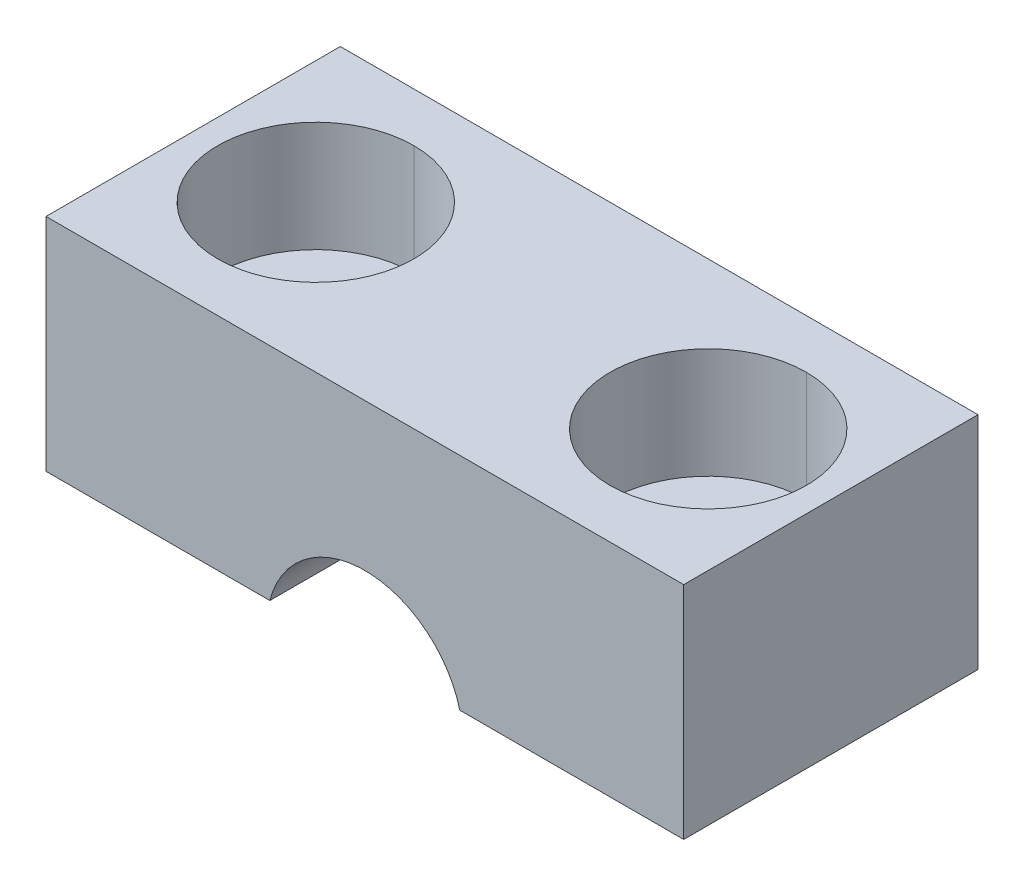
ISO-10303-21;
HEADER;
FILE_DESCRIPTION(('STEP AP214'),'2;1');
FILE_NAME('part.step','',(''),(''),'','','');
FILE_SCHEMA(('AUTOMOTIVE_DESIGN { 1 0 10303 214 1 1 1 1 }'));
ENDSEC;
DATA;
#1=APPLICATION_CONTEXT('core data for automotive mechanical design processes');
#2=APPLICATION_PROTOCOL_DEFINITION('international standard','automotive_design',2000,#1);
#3=PRODUCT_CONTEXT('',#1,'mechanical');
#4=PRODUCT('Part','Part','',(#3));
#5=PRODUCT_RELATED_PRODUCT_CATEGORY('part','',(#4));
#6=PRODUCT_DEFINITION_FORMATION('','',#4);
#7=PRODUCT_DEFINITION_CONTEXT('part definition',#1,'design');
#8=PRODUCT_DEFINITION('design','',#6,#7);
#9=PRODUCT_DEFINITION_SHAPE('','',#8);
#10=(LENGTH_UNIT() NAMED_UNIT(*) SI_UNIT(.MILLI.,.METRE.));
#11=(NAMED_UNIT(*) PLANE_ANGLE_UNIT() SI_UNIT($,.RADIAN.));
#12=(NAMED_UNIT(*) SI_UNIT($,.STERADIAN.) SOLID_ANGLE_UNIT());
#13=UNCERTAINTY_MEASURE_WITH_UNIT(LENGTH_MEASURE(1.E-05),#10,'distance_accuracy_value','');
#14=(GEOMETRIC_REPRESENTATION_CONTEXT(3) GLOBAL_UNCERTAINTY_ASSIGNED_CONTEXT((#13)) GLOBAL_UNIT_ASSIGNED_CONTEXT((#10,
#11,#12)) REPRESENTATION_CONTEXT('',''));
#15=CARTESIAN_POINT('',(0.,0.,0.));
#16=DIRECTION('',(0.,0.,1.));
#17=DIRECTION('',(1.,0.,0.));
#18=AXIS2_PLACEMENT_3D('',#15,#16,#17);
#19=CARTESIAN_POINT('',(13.,35.,6.));
#20=DIRECTION('',(0.,-1.,0.));
#21=DIRECTION('',(0.,0.,-1.));
#22=AXIS2_PLACEMENT_3D('',#19,#20,#21);
#23=PLANE('',#22);
#24=CARTESIAN_POINT('',(-8.,35.,0.));
#25=DIRECTION('',(0.,1.,0.));
#26=DIRECTION('',(0.,0.,1.));
#27=AXIS2_PLACEMENT_3D('',#24,#25,#26);
#28=CIRCLE('',#27,4.);
#29=CARTESIAN_POINT('',(-8.,35.,-4.));
#30=VERTEX_POINT('',#29);
#31=CARTESIAN_POINT('',(-8.,35.,4.));
#32=VERTEX_POINT('',#31);
#33=EDGE_CURVE('E11',#30,#32,#28,.T.);
#34=ORIENTED_EDGE('',*,*,#33,.F.);
#35=CARTESIAN_POINT('',(-8.,35.,0.));
#36=DIRECTION('',(0.,1.,0.));
#37=DIRECTION('',(0.,0.,1.));
#38=AXIS2_PLACEMENT_3D('',#35,#36,#37);
#39=CIRCLE('',#38,4.);
#40=EDGE_CURVE('E25',#32,#30,#39,.T.);
#41=ORIENTED_EDGE('',*,*,#40,.F.);
#42=EDGE_LOOP('',(#34,#41));
#43=FACE_BOUND('',#42,.T.);
#44=CARTESIAN_POINT('',(8.,35.,0.));
#45=DIRECTION('',(0.,1.,0.));
#46=DIRECTION('',(0.,0.,1.));
#47=AXIS2_PLACEMENT_3D('',#44,#45,#46);
#48=CIRCLE('',#47,4.);
#49=CARTESIAN_POINT('',(8.,35.,-4.));
#50=VERTEX_POINT('',#49);
#51=CARTESIAN_POINT('',(8.,35.,4.));
#52=VERTEX_POINT('',#51);
#53=EDGE_CURVE('E137',#50,#52,#48,.T.);
#54=ORIENTED_EDGE('',*,*,#53,.F.);
#55=CARTESIAN_POINT('',(8.,35.,0.));
#56=DIRECTION('',(0.,1.,0.));
#57=DIRECTION('',(0.,0.,1.));
#58=AXIS2_PLACEMENT_3D('',#55,#56,#57);
#59=CIRCLE('',#58,4.);
#60=EDGE_CURVE('E308',#52,#50,#59,.T.);
#61=ORIENTED_EDGE('',*,*,#60,.F.);
#62=EDGE_LOOP('',(#54,#61));
#63=FACE_BOUND('',#62,.T.);
#64=DIRECTION('',(-1.,0.,0.));
#65=VECTOR('',#64,1.);
#66=CARTESIAN_POINT('',(13.,35.,-6.));
#67=LINE('',#66,#65);
#68=CARTESIAN_POINT('',(13.,35.,-6.));
#69=VERTEX_POINT('',#68);
#70=CARTESIAN_POINT('',(-13.,35.,-6.));
#71=VERTEX_POINT('',#70);
#72=EDGE_CURVE('E304',#69,#71,#67,.T.);
#73=ORIENTED_EDGE('',*,*,#72,.T.);
#74=DIRECTION('',(0.,0.,-1.));
#75=VECTOR('',#74,1.);
#76=CARTESIAN_POINT('',(-13.,35.,6.));
#77=LINE('',#76,#75);
#78=CARTESIAN_POINT('',(-13.,35.,6.));
#79=VERTEX_POINT('',#78);
#80=EDGE_CURVE('E299',#79,#71,#77,.T.);
#81=ORIENTED_EDGE('',*,*,#80,.F.);
#82=DIRECTION('',(-1.,0.,0.));
#83=VECTOR('',#82,1.);
#84=CARTESIAN_POINT('',(13.,35.,6.));
#85=LINE('',#84,#83);
#86=CARTESIAN_POINT('',(13.,35.,6.));
#87=VERTEX_POINT('',#86);
#88=EDGE_CURVE('E294',#87,#79,#85,.T.);
#89=ORIENTED_EDGE('',*,*,#88,.F.);
#90=DIRECTION('',(0.,0.,-1.));
#91=VECTOR('',#90,1.);
#92=CARTESIAN_POINT('',(13.,35.,6.));
#93=LINE('',#92,#91);
#94=EDGE_CURVE('E290',#87,#69,#93,.T.);
#95=ORIENTED_EDGE('',*,*,#94,.T.);
#96=EDGE_LOOP('',(#73,#81,#89,#95));
#97=FACE_BOUND('',#96,.T.);
#98=ADVANCED_FACE('F17',(#43,#63,#97),#23,.F.);
#99=CARTESIAN_POINT('',(13.,26.,6.));
#100=DIRECTION('',(-1.,0.,0.));
#101=DIRECTION('',(0.,0.,1.));
#102=AXIS2_PLACEMENT_3D('',#99,#100,#101);
#103=PLANE('',#102);
#104=DIRECTION('',(0.,1.,0.));
#105=VECTOR('',#104,1.);
#106=CARTESIAN_POINT('',(13.,26.,-6.));
#107=LINE('',#106,#105);
#108=CARTESIAN_POINT('',(13.,26.,-6.));
#109=VERTEX_POINT('',#108);
#110=EDGE_CURVE('E285',#109,#69,#107,.T.);
#111=ORIENTED_EDGE('',*,*,#110,.T.);
#112=ORIENTED_EDGE('',*,*,#94,.F.);
#113=DIRECTION('',(0.,1.,0.));
#114=VECTOR('',#113,1.);
#115=CARTESIAN_POINT('',(13.,26.,6.));
#116=LINE('',#115,#114);
#117=CARTESIAN_POINT('',(13.,26.,6.));
#118=VERTEX_POINT('',#117);
#119=EDGE_CURVE('E280',#118,#87,#116,.T.);
#120=ORIENTED_EDGE('',*,*,#119,.F.);
#121=DIRECTION('',(0.,0.,-1.));
#122=VECTOR('',#121,1.);
#123=CARTESIAN_POINT('',(13.,26.,6.));
#124=LINE('',#123,#122);
#125=EDGE_CURVE('E276',#118,#109,#124,.T.);
#126=ORIENTED_EDGE('',*,*,#125,.T.);
#127=EDGE_LOOP('',(#111,#112,#120,#126));
#128=FACE_BOUND('',#127,.T.);
#129=ADVANCED_FACE('F369',(#128),#103,.F.);
#130=CARTESIAN_POINT('',(3.8729833462074,26.,6.));
#131=DIRECTION('',(0.,1.,0.));
#132=DIRECTION('',(0.,0.,1.));
#133=AXIS2_PLACEMENT_3D('',#130,#131,#132);
#134=PLANE('',#133);
#135=CARTESIAN_POINT('',(8.,26.,0.));
#136=DIRECTION('',(0.,1.,0.));
#137=DIRECTION('',(0.,0.,1.));
#138=AXIS2_PLACEMENT_3D('',#135,#136,#137);
#139=CIRCLE('',#138,2.25);
#140=CARTESIAN_POINT('',(8.,26.,2.25));
#141=VERTEX_POINT('',#140);
#142=CARTESIAN_POINT('',(8.,26.,-2.25));
#143=VERTEX_POINT('',#142);
#144=EDGE_CURVE('E272',#141,#143,#139,.T.);
#145=ORIENTED_EDGE('',*,*,#144,.T.);
#146=CARTESIAN_POINT('',(8.,26.,0.));
#147=DIRECTION('',(0.,1.,0.));
#148=DIRECTION('',(0.,0.,1.));
#149=AXIS2_PLACEMENT_3D('',#146,#147,#148);
#150=CIRCLE('',#149,2.25);
#151=EDGE_CURVE('E267',#143,#141,#150,.T.);
#152=ORIENTED_EDGE('',*,*,#151,.T.);
#153=EDGE_LOOP('',(#145,#152));
#154=FACE_BOUND('',#153,.T.);
#155=DIRECTION('',(1.,0.,0.));
#156=VECTOR('',#155,1.);
#157=CARTESIAN_POINT('',(3.8729833462074,26.,-6.));
#158=LINE('',#157,#156);
#159=CARTESIAN_POINT('',(3.8729833462074,26.,-6.));
#160=VERTEX_POINT('',#159);
#161=EDGE_CURVE('E261',#160,#109,#158,.T.);
#162=ORIENTED_EDGE('',*,*,#161,.T.);
#163=ORIENTED_EDGE('',*,*,#125,.F.);
#164=DIRECTION('',(1.,0.,0.));
#165=VECTOR('',#164,1.);
#166=CARTESIAN_POINT('',(3.8729833462074,26.,6.));
#167=LINE('',#166,#165);
#168=CARTESIAN_POINT('',(3.8729833462074,26.,6.));
#169=VERTEX_POINT('',#168);
#170=EDGE_CURVE('E255',#169,#118,#167,.T.);
#171=ORIENTED_EDGE('',*,*,#170,.F.);
#172=DIRECTION('',(0.,0.,-1.));
#173=VECTOR('',#172,1.);
#174=CARTESIAN_POINT('',(3.8729833462074,26.,6.));
#175=LINE('',#174,#173);
#176=EDGE_CURVE('E250',#169,#160,#175,.T.);
#177=ORIENTED_EDGE('',*,*,#176,.T.);
#178=EDGE_LOOP('',(#162,#163,#171,#177));
#179=FACE_BOUND('',#178,.T.);
#180=ADVANCED_FACE('F372',(#154,#179),#134,.F.);
#181=CARTESIAN_POINT('',(0.,25.,6.));
#182=DIRECTION('',(0.,0.,-1.));
#183=DIRECTION('',(0.,-1.,0.));
#184=AXIS2_PLACEMENT_3D('',#181,#182,#183);
#185=CYLINDRICAL_SURFACE('',#184,4.);
#186=CARTESIAN_POINT('',(0.,25.,-6.));
#187=DIRECTION('',(0.,0.,1.));
#188=DIRECTION('',(1.,0.,0.));
#189=AXIS2_PLACEMENT_3D('',#186,#187,#188);
#190=CIRCLE('',#189,4.);
#191=CARTESIAN_POINT('',(-3.8729833462074,26.,-6.));
#192=VERTEX_POINT('',#191);
#193=EDGE_CURVE('E244',#160,#192,#190,.T.);
#194=ORIENTED_EDGE('',*,*,#193,.F.);
#195=ORIENTED_EDGE('',*,*,#176,.F.);
#196=CARTESIAN_POINT('',(0.,25.,6.));
#197=DIRECTION('',(0.,0.,1.));
#198=DIRECTION('',(1.,0.,0.));
#199=AXIS2_PLACEMENT_3D('',#196,#197,#198);
#200=CIRCLE('',#199,4.);
#201=CARTESIAN_POINT('',(-3.8729833462074,26.,6.));
#202=VERTEX_POINT('',#201);
#203=EDGE_CURVE('E239',#169,#202,#200,.T.);
#204=ORIENTED_EDGE('',*,*,#203,.T.);
#205=DIRECTION('',(0.,0.,-1.));
#206=VECTOR('',#205,1.);
#207=CARTESIAN_POINT('',(-3.8729833462074,26.,6.));
#208=LINE('',#207,#206);
#209=EDGE_CURVE('E234',#202,#192,#208,.T.);
#210=ORIENTED_EDGE('',*,*,#209,.T.);
#211=EDGE_LOOP('',(#194,#195,#204,#210));
#212=FACE_BOUND('',#211,.T.);
#213=ADVANCED_FACE('F347',(#212),#185,.F.);
#214=CARTESIAN_POINT('',(-13.,26.,6.));
#215=DIRECTION('',(0.,1.,0.));
#216=DIRECTION('',(0.,0.,1.));
#217=AXIS2_PLACEMENT_3D('',#214,#215,#216);
#218=PLANE('',#217);
#219=CARTESIAN_POINT('',(-8.,26.,0.));
#220=DIRECTION('',(0.,1.,0.));
#221=DIRECTION('',(0.,0.,1.));
#222=AXIS2_PLACEMENT_3D('',#219,#220,#221);
#223=CIRCLE('',#222,2.25);
#224=CARTESIAN_POINT('',(-8.,26.,2.25));
#225=VERTEX_POINT('',#224);
#226=CARTESIAN_POINT('',(-8.,26.,-2.25));
#227=VERTEX_POINT('',#226);
#228=EDGE_CURVE('E229',#225,#227,#223,.T.);
#229=ORIENTED_EDGE('',*,*,#228,.T.);
#230=CARTESIAN_POINT('',(-8.,26.,0.));
#231=DIRECTION('',(0.,1.,0.));
#232=DIRECTION('',(0.,0.,1.));
#233=AXIS2_PLACEMENT_3D('',#230,#231,#232);
#234=CIRCLE('',#233,2.25);
#235=EDGE_CURVE('E225',#227,#225,#234,.T.);
#236=ORIENTED_EDGE('',*,*,#235,.T.);
#237=EDGE_LOOP('',(#229,#236));
#238=FACE_BOUND('',#237,.T.);
#239=DIRECTION('',(1.,0.,0.));
#240=VECTOR('',#239,1.);
#241=CARTESIAN_POINT('',(-13.,26.,-6.));
#242=LINE('',#241,#240);
#243=CARTESIAN_POINT('',(-13.,26.,-6.));
#244=VERTEX_POINT('',#243);
#245=EDGE_CURVE('E219',#244,#192,#242,.T.);
#246=ORIENTED_EDGE('',*,*,#245,.T.);
#247=ORIENTED_EDGE('',*,*,#209,.F.);
#248=DIRECTION('',(1.,0.,0.));
#249=VECTOR('',#248,1.);
#250=CARTESIAN_POINT('',(-13.,26.,6.));
#251=LINE('',#250,#249);
#252=CARTESIAN_POINT('',(-13.,26.,6.));
#253=VERTEX_POINT('',#252);
#254=EDGE_CURVE('E213',#253,#202,#251,.T.);
#255=ORIENTED_EDGE('',*,*,#254,.F.);
#256=DIRECTION('',(0.,0.,-1.));
#257=VECTOR('',#256,1.);
#258=CARTESIAN_POINT('',(-13.,26.,6.));
#259=LINE('',#258,#257);
#260=EDGE_CURVE('E209',#253,#244,#259,.T.);
#261=ORIENTED_EDGE('',*,*,#260,.T.);
#262=EDGE_LOOP('',(#246,#247,#255,#261));
#263=FACE_BOUND('',#262,.T.);
#264=ADVANCED_FACE('F343',(#238,#263),#218,.F.);
#265=CARTESIAN_POINT('',(-13.,35.,6.));
#266=DIRECTION('',(1.,0.,0.));
#267=DIRECTION('',(0.,0.,-1.));
#268=AXIS2_PLACEMENT_3D('',#265,#266,#267);
#269=PLANE('',#268);
#270=DIRECTION('',(0.,-1.,0.));
#271=VECTOR('',#270,1.);
#272=CARTESIAN_POINT('',(-13.,35.,-6.));
#273=LINE('',#272,#271);
#274=EDGE_CURVE('E204',#71,#244,#273,.T.);
#275=ORIENTED_EDGE('',*,*,#274,.T.);
#276=ORIENTED_EDGE('',*,*,#260,.F.);
#277=DIRECTION('',(0.,-1.,0.));
#278=VECTOR('',#277,1.);
#279=CARTESIAN_POINT('',(-13.,35.,6.));
#280=LINE('',#279,#278);
#281=EDGE_CURVE('E199',#79,#253,#280,.T.);
#282=ORIENTED_EDGE('',*,*,#281,.F.);
#283=ORIENTED_EDGE('',*,*,#80,.T.);
#284=EDGE_LOOP('',(#275,#276,#282,#283));
#285=FACE_BOUND('',#284,.T.);
#286=ADVANCED_FACE('F346',(#285),#269,.F.);
#287=CARTESIAN_POINT('',(0.,25.,6.));
#288=DIRECTION('',(0.,0.,1.));
#289=DIRECTION('',(1.,0.,0.));
#290=AXIS2_PLACEMENT_3D('',#287,#288,#289);
#291=PLANE('',#290);
#292=ORIENTED_EDGE('',*,*,#88,.T.);
#293=ORIENTED_EDGE('',*,*,#281,.T.);
#294=ORIENTED_EDGE('',*,*,#254,.T.);
#295=ORIENTED_EDGE('',*,*,#203,.F.);
#296=ORIENTED_EDGE('',*,*,#170,.T.);
#297=ORIENTED_EDGE('',*,*,#119,.T.);
#298=EDGE_LOOP('',(#292,#293,#294,#295,#296,#297));
#299=FACE_BOUND('',#298,.T.);
#300=ADVANCED_FACE('F363',(#299),#291,.T.);
#301=CARTESIAN_POINT('',(0.,25.,-6.));
#302=DIRECTION('',(0.,0.,1.));
#303=DIRECTION('',(1.,0.,0.));
#304=AXIS2_PLACEMENT_3D('',#301,#302,#303);
#305=PLANE('',#304);
#306=ORIENTED_EDGE('',*,*,#72,.F.);
#307=ORIENTED_EDGE('',*,*,#110,.F.);
#308=ORIENTED_EDGE('',*,*,#161,.F.);
#309=ORIENTED_EDGE('',*,*,#193,.T.);
#310=ORIENTED_EDGE('',*,*,#245,.F.);
#311=ORIENTED_EDGE('',*,*,#274,.F.);
#312=EDGE_LOOP('',(#306,#307,#308,#309,#310,#311));
#313=FACE_BOUND('',#312,.T.);
#314=ADVANCED_FACE('F357',(#313),#305,.F.);
#315=CARTESIAN_POINT('',(-8.,35.,0.));
#316=DIRECTION('',(0.,1.,0.));
#317=DIRECTION('',(1.,0.,0.));
#318=AXIS2_PLACEMENT_3D('',#315,#316,#317);
#319=CYLINDRICAL_SURFACE('',#318,2.25);
#320=DIRECTION('',(0.,1.,0.));
#321=VECTOR('',#320,1.);
#322=CARTESIAN_POINT('',(-8.,26.,-2.25));
#323=LINE('',#322,#321);
#324=CARTESIAN_POINT('',(-8.,30.5,-2.25));
#325=VERTEX_POINT('',#324);
#326=EDGE_CURVE('E195',#227,#325,#323,.T.);
#327=ORIENTED_EDGE('',*,*,#326,.T.);
#328=CARTESIAN_POINT('',(-8.,30.5,0.));
#329=DIRECTION('',(0.,1.,0.));
#330=DIRECTION('',(0.,0.,1.));
#331=AXIS2_PLACEMENT_3D('',#328,#329,#330);
#332=CIRCLE('',#331,2.25);
#333=CARTESIAN_POINT('',(-8.,30.5,2.25));
#334=VERTEX_POINT('',#333);
#335=EDGE_CURVE('E191',#325,#334,#332,.T.);
#336=ORIENTED_EDGE('',*,*,#335,.T.);
#337=DIRECTION('',(0.,1.,0.));
#338=VECTOR('',#337,1.);
#339=CARTESIAN_POINT('',(-8.,26.,2.25));
#340=LINE('',#339,#338);
#341=EDGE_CURVE('E186',#225,#334,#340,.T.);
#342=ORIENTED_EDGE('',*,*,#341,.F.);
#343=ORIENTED_EDGE('',*,*,#235,.F.);
#344=EDGE_LOOP('',(#327,#336,#342,#343));
#345=FACE_BOUND('',#344,.T.);
#346=ADVANCED_FACE('F337',(#345),#319,.F.);
#347=CARTESIAN_POINT('',(-8.,35.,0.));
#348=DIRECTION('',(0.,1.,0.));
#349=DIRECTION('',(-1.,0.,0.));
#350=AXIS2_PLACEMENT_3D('',#347,#348,#349);
#351=CYLINDRICAL_SURFACE('',#350,2.25);
#352=ORIENTED_EDGE('',*,*,#326,.F.);
#353=ORIENTED_EDGE('',*,*,#228,.F.);
#354=ORIENTED_EDGE('',*,*,#341,.T.);
#355=CARTESIAN_POINT('',(-8.,30.5,0.));
#356=DIRECTION('',(0.,1.,0.));
#357=DIRECTION('',(0.,0.,1.));
#358=AXIS2_PLACEMENT_3D('',#355,#356,#357);
#359=CIRCLE('',#358,2.25);
#360=EDGE_CURVE('E181',#334,#325,#359,.T.);
#361=ORIENTED_EDGE('',*,*,#360,.T.);
#362=EDGE_LOOP('',(#352,#353,#354,#361));
#363=FACE_BOUND('',#362,.T.);
#364=ADVANCED_FACE('F331',(#363),#351,.F.);
#365=CARTESIAN_POINT('',(-10.25,30.5,0.));
#366=DIRECTION('',(0.,1.,0.));
#367=DIRECTION('',(0.,0.,1.));
#368=AXIS2_PLACEMENT_3D('',#365,#366,#367);
#369=PLANE('',#368);
#370=CARTESIAN_POINT('',(-8.,30.5,0.));
#371=DIRECTION('',(0.,1.,0.));
#372=DIRECTION('',(0.,0.,1.));
#373=AXIS2_PLACEMENT_3D('',#370,#371,#372);
#374=CIRCLE('',#373,4.);
#375=CARTESIAN_POINT('',(-8.,30.5,4.));
#376=VERTEX_POINT('',#375);
#377=CARTESIAN_POINT('',(-8.,30.5,-4.));
#378=VERTEX_POINT('',#377);
#379=EDGE_CURVE('E176',#376,#378,#374,.T.);
#380=ORIENTED_EDGE('',*,*,#379,.T.);
#381=CARTESIAN_POINT('',(-8.,30.5,0.));
#382=DIRECTION('',(0.,1.,0.));
#383=DIRECTION('',(0.,0.,1.));
#384=AXIS2_PLACEMENT_3D('',#381,#382,#383);
#385=CIRCLE('',#384,4.);
#386=EDGE_CURVE('E172',#378,#376,#385,.T.);
#387=ORIENTED_EDGE('',*,*,#386,.T.);
#388=EDGE_LOOP('',(#380,#387));
#389=FACE_BOUND('',#388,.T.);
#390=ORIENTED_EDGE('',*,*,#335,.F.);
#391=ORIENTED_EDGE('',*,*,#360,.F.);
#392=EDGE_LOOP('',(#390,#391));
#393=FACE_BOUND('',#392,.T.);
#394=ADVANCED_FACE('F328',(#389,#393),#369,.T.);
#395=CARTESIAN_POINT('',(-8.,35.,0.));
#396=DIRECTION('',(0.,1.,0.));
#397=DIRECTION('',(1.,0.,0.));
#398=AXIS2_PLACEMENT_3D('',#395,#396,#397);
#399=CYLINDRICAL_SURFACE('',#398,4.);
#400=DIRECTION('',(0.,1.,0.));
#401=VECTOR('',#400,1.);
#402=CARTESIAN_POINT('',(-8.,30.5,-4.));
#403=LINE('',#402,#401);
#404=EDGE_CURVE('E168',#378,#30,#403,.T.);
#405=ORIENTED_EDGE('',*,*,#404,.T.);
#406=ORIENTED_EDGE('',*,*,#33,.T.);
#407=DIRECTION('',(0.,1.,0.));
#408=VECTOR('',#407,1.);
#409=CARTESIAN_POINT('',(-8.,30.5,4.));
#410=LINE('',#409,#408);
#411=EDGE_CURVE('E164',#376,#32,#410,.T.);
#412=ORIENTED_EDGE('',*,*,#411,.F.);
#413=ORIENTED_EDGE('',*,*,#386,.F.);
#414=EDGE_LOOP('',(#405,#406,#412,#413));
#415=FACE_BOUND('',#414,.T.);
#416=ADVANCED_FACE('F326',(#415),#399,.F.);
#417=CARTESIAN_POINT('',(-8.,35.,0.));
#418=DIRECTION('',(0.,1.,0.));
#419=DIRECTION('',(-1.,0.,0.));
#420=AXIS2_PLACEMENT_3D('',#417,#418,#419);
#421=CYLINDRICAL_SURFACE('',#420,4.);
#422=ORIENTED_EDGE('',*,*,#404,.F.);
#423=ORIENTED_EDGE('',*,*,#379,.F.);
#424=ORIENTED_EDGE('',*,*,#411,.T.);
#425=ORIENTED_EDGE('',*,*,#40,.T.);
#426=EDGE_LOOP('',(#422,#423,#424,#425));
#427=FACE_BOUND('',#426,.T.);
#428=ADVANCED_FACE('F321',(#427),#421,.F.);
#429=CARTESIAN_POINT('',(8.,35.,0.));
#430=DIRECTION('',(0.,1.,0.));
#431=DIRECTION('',(1.,0.,0.));
#432=AXIS2_PLACEMENT_3D('',#429,#430,#431);
#433=CYLINDRICAL_SURFACE('',#432,2.25);
#434=DIRECTION('',(0.,1.,0.));
#435=VECTOR('',#434,1.);
#436=CARTESIAN_POINT('',(8.,26.,-2.25));
#437=LINE('',#436,#435);
#438=CARTESIAN_POINT('',(8.,30.5,-2.25));
#439=VERTEX_POINT('',#438);
#440=EDGE_CURVE('E160',#143,#439,#437,.T.);
#441=ORIENTED_EDGE('',*,*,#440,.T.);
#442=CARTESIAN_POINT('',(8.,30.5,0.));
#443=DIRECTION('',(0.,1.,0.));
#444=DIRECTION('',(0.,0.,1.));
#445=AXIS2_PLACEMENT_3D('',#442,#443,#444);
#446=CIRCLE('',#445,2.25);
#447=CARTESIAN_POINT('',(8.,30.5,2.25));
#448=VERTEX_POINT('',#447);
#449=EDGE_CURVE('E156',#439,#448,#446,.T.);
#450=ORIENTED_EDGE('',*,*,#449,.T.);
#451=DIRECTION('',(0.,1.,0.));
#452=VECTOR('',#451,1.);
#453=CARTESIAN_POINT('',(8.,26.,2.25));
#454=LINE('',#453,#452);
#455=EDGE_CURVE('E151',#141,#448,#454,.T.);
#456=ORIENTED_EDGE('',*,*,#455,.F.);
#457=ORIENTED_EDGE('',*,*,#151,.F.);
#458=EDGE_LOOP('',(#441,#450,#456,#457));
#459=FACE_BOUND('',#458,.T.);
#460=ADVANCED_FACE('F488',(#459),#433,.F.);
#461=CARTESIAN_POINT('',(8.,35.,0.));
#462=DIRECTION('',(0.,1.,0.));
#463=DIRECTION('',(-1.,0.,0.));
#464=AXIS2_PLACEMENT_3D('',#461,#462,#463);
#465=CYLINDRICAL_SURFACE('',#464,2.25);
#466=ORIENTED_EDGE('',*,*,#440,.F.);
#467=ORIENTED_EDGE('',*,*,#144,.F.);
#468=ORIENTED_EDGE('',*,*,#455,.T.);
#469=CARTESIAN_POINT('',(8.,30.5,0.));
#470=DIRECTION('',(0.,1.,0.));
#471=DIRECTION('',(0.,0.,1.));
#472=AXIS2_PLACEMENT_3D('',#469,#470,#471);
#473=CIRCLE('',#472,2.25);
#474=EDGE_CURVE('E134',#448,#439,#473,.T.);
#475=ORIENTED_EDGE('',*,*,#474,.T.);
#476=EDGE_LOOP('',(#466,#467,#468,#475));
#477=FACE_BOUND('',#476,.T.);
#478=ADVANCED_FACE('F498',(#477),#465,.F.);
#479=CARTESIAN_POINT('',(5.75,30.5,0.));
#480=DIRECTION('',(0.,1.,0.));
#481=DIRECTION('',(0.,0.,1.));
#482=AXIS2_PLACEMENT_3D('',#479,#480,#481);
#483=PLANE('',#482);
#484=CARTESIAN_POINT('',(8.,30.5,0.));
#485=DIRECTION('',(0.,1.,0.));
#486=DIRECTION('',(0.,0.,1.));
#487=AXIS2_PLACEMENT_3D('',#484,#485,#486);
#488=CIRCLE('',#487,4.);
#489=CARTESIAN_POINT('',(8.,30.5,4.));
#490=VERTEX_POINT('',#489);
#491=CARTESIAN_POINT('',(8.,30.5,-4.));
#492=VERTEX_POINT('',#491);
#493=EDGE_CURVE('E121',#490,#492,#488,.T.);
#494=ORIENTED_EDGE('',*,*,#493,.T.);
#495=CARTESIAN_POINT('',(8.,30.5,0.));
#496=DIRECTION('',(0.,1.,0.));
#497=DIRECTION('',(0.,0.,1.));
#498=AXIS2_PLACEMENT_3D('',#495,#496,#497);
#499=CIRCLE('',#498,4.);
#500=EDGE_CURVE('E117',#492,#490,#499,.T.);
#501=ORIENTED_EDGE('',*,*,#500,.T.);
#502=EDGE_LOOP('',(#494,#501));
#503=FACE_BOUND('',#502,.T.);
#504=ORIENTED_EDGE('',*,*,#449,.F.);
#505=ORIENTED_EDGE('',*,*,#474,.F.);
#506=EDGE_LOOP('',(#504,#505));
#507=FACE_BOUND('',#506,.T.);
#508=ADVANCED_FACE('F119',(#503,#507),#483,.T.);
#509=CARTESIAN_POINT('',(8.,35.,0.));
#510=DIRECTION('',(0.,1.,0.));
#511=DIRECTION('',(1.,0.,0.));
#512=AXIS2_PLACEMENT_3D('',#509,#510,#511);
#513=CYLINDRICAL_SURFACE('',#512,4.);
#514=DIRECTION('',(0.,1.,0.));
#515=VECTOR('',#514,1.);
#516=CARTESIAN_POINT('',(8.,30.5,-4.));
#517=LINE('',#516,#515);
#518=EDGE_CURVE('E126',#492,#50,#517,.T.);
#519=ORIENTED_EDGE('',*,*,#518,.T.);
#520=ORIENTED_EDGE('',*,*,#53,.T.);
#521=DIRECTION('',(0.,1.,0.));
#522=VECTOR('',#521,1.);
#523=CARTESIAN_POINT('',(8.,30.5,4.));
#524=LINE('',#523,#522);
#525=EDGE_CURVE('E132',#490,#52,#524,.T.);
#526=ORIENTED_EDGE('',*,*,#525,.F.);
#527=ORIENTED_EDGE('',*,*,#500,.F.);
#528=EDGE_LOOP('',(#519,#520,#526,#527));
#529=FACE_BOUND('',#528,.T.);
#530=ADVANCED_FACE('F136',(#529),#513,.F.);
#531=CARTESIAN_POINT('',(8.,35.,0.));
#532=DIRECTION('',(0.,1.,0.));
#533=DIRECTION('',(-1.,0.,0.));
#534=AXIS2_PLACEMENT_3D('',#531,#532,#533);
#535=CYLINDRICAL_SURFACE('',#534,4.);
#536=ORIENTED_EDGE('',*,*,#518,.F.);
#537=ORIENTED_EDGE('',*,*,#493,.F.);
#538=ORIENTED_EDGE('',*,*,#525,.T.);
#539=ORIENTED_EDGE('',*,*,#60,.T.);
#540=EDGE_LOOP('',(#536,#537,#538,#539));
#541=FACE_BOUND('',#540,.T.);
#542=ADVANCED_FACE('F130',(#541),#535,.F.);
#543=CLOSED_SHELL('',(#98,#129,#180,#213,#264,#286,#300,#314,#346,#364,#394,#416,#428,#460,#478,
#508,#530,#542));
#544=MANIFOLD_SOLID_BREP('B1',#543);
#545=ADVANCED_BREP_SHAPE_REPRESENTATION('',(#18,#544),#14);
#546=SHAPE_DEFINITION_REPRESENTATION(#9,#545);
ENDSEC;
END-ISO-10303-21;
